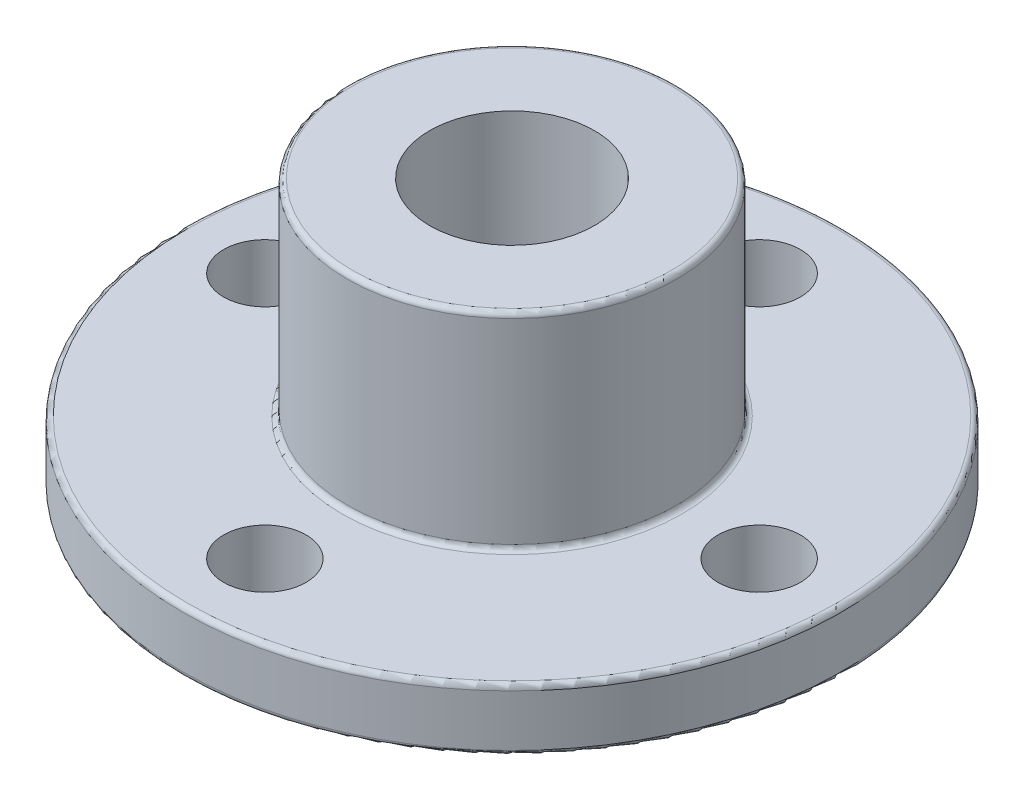
ISO-10303-21;
HEADER;
FILE_DESCRIPTION(('STEP AP214'),'2;1');
FILE_NAME('part.step','',(''),(''),'','','');
FILE_SCHEMA(('AUTOMOTIVE_DESIGN { 1 0 10303 214 1 1 1 1 }'));
ENDSEC;
DATA;
#1=APPLICATION_CONTEXT('core data for automotive mechanical design processes');
#2=APPLICATION_PROTOCOL_DEFINITION('international standard','automotive_design',2000,#1);
#3=PRODUCT_CONTEXT('',#1,'mechanical');
#4=PRODUCT('Part','Part','',(#3));
#5=PRODUCT_RELATED_PRODUCT_CATEGORY('part','',(#4));
#6=PRODUCT_DEFINITION_FORMATION('','',#4);
#7=PRODUCT_DEFINITION_CONTEXT('part definition',#1,'design');
#8=PRODUCT_DEFINITION('design','',#6,#7);
#9=PRODUCT_DEFINITION_SHAPE('','',#8);
#10=(LENGTH_UNIT() NAMED_UNIT(*) SI_UNIT(.MILLI.,.METRE.));
#11=(NAMED_UNIT(*) PLANE_ANGLE_UNIT() SI_UNIT($,.RADIAN.));
#12=(NAMED_UNIT(*) SI_UNIT($,.STERADIAN.) SOLID_ANGLE_UNIT());
#13=UNCERTAINTY_MEASURE_WITH_UNIT(LENGTH_MEASURE(1.E-05),#10,'distance_accuracy_value','');
#14=(GEOMETRIC_REPRESENTATION_CONTEXT(3) GLOBAL_UNCERTAINTY_ASSIGNED_CONTEXT((#13)) GLOBAL_UNIT_ASSIGNED_CONTEXT((#10,
#11,#12)) REPRESENTATION_CONTEXT('',''));
#15=CARTESIAN_POINT('',(0.,0.,0.));
#16=DIRECTION('',(0.,0.,1.));
#17=DIRECTION('',(1.,0.,0.));
#18=AXIS2_PLACEMENT_3D('',#15,#16,#17);
#19=CARTESIAN_POINT('',(0.,3.,0.));
#20=DIRECTION('',(0.,-1.,0.));
#21=DIRECTION('',(0.,0.,-1.));
#22=AXIS2_PLACEMENT_3D('',#19,#20,#21);
#23=CYLINDRICAL_SURFACE('',#22,16.);
#24=CARTESIAN_POINT('',(0.,0.25,0.));
#25=DIRECTION('',(0.,1.,0.));
#26=DIRECTION('',(0.,0.,1.));
#27=AXIS2_PLACEMENT_3D('',#24,#25,#26);
#28=CIRCLE('',#27,16.);
#29=CARTESIAN_POINT('',(0.,0.25,16.));
#30=VERTEX_POINT('',#29);
#31=EDGE_CURVE('E63',#30,#30,#28,.T.);
#32=ORIENTED_EDGE('',*,*,#31,.T.);
#33=EDGE_LOOP('',(#32));
#34=FACE_BOUND('',#33,.T.);
#35=CARTESIAN_POINT('',(0.,2.75,0.));
#36=DIRECTION('',(0.,1.,0.));
#37=DIRECTION('',(0.,0.,1.));
#38=AXIS2_PLACEMENT_3D('',#35,#36,#37);
#39=CIRCLE('',#38,16.);
#40=CARTESIAN_POINT('',(0.,2.75,16.));
#41=VERTEX_POINT('',#40);
#42=EDGE_CURVE('E66',#41,#41,#39,.F.);
#43=ORIENTED_EDGE('',*,*,#42,.T.);
#44=EDGE_LOOP('',(#43));
#45=FACE_BOUND('',#44,.T.);
#46=ADVANCED_FACE('F37',(#34,#45),#23,.T.);
#47=CARTESIAN_POINT('',(0.,3.,0.));
#48=DIRECTION('',(0.,1.,0.));
#49=DIRECTION('',(0.,0.,1.));
#50=AXIS2_PLACEMENT_3D('',#47,#48,#49);
#51=PLANE('',#50);
#52=CARTESIAN_POINT('',(0.,3.,-12.));
#53=DIRECTION('',(0.,1.,0.));
#54=DIRECTION('',(0.,0.,1.));
#55=AXIS2_PLACEMENT_3D('',#52,#53,#54);
#56=CIRCLE('',#55,2.);
#57=CARTESIAN_POINT('',(0.,3.,-10.));
#58=VERTEX_POINT('',#57);
#59=EDGE_CURVE('E92',#58,#58,#56,.T.);
#60=ORIENTED_EDGE('',*,*,#59,.F.);
#61=EDGE_LOOP('',(#60));
#62=FACE_BOUND('',#61,.T.);
#63=CARTESIAN_POINT('',(-12.,3.,0.));
#64=DIRECTION('',(0.,1.,0.));
#65=DIRECTION('',(0.,0.,1.));
#66=AXIS2_PLACEMENT_3D('',#63,#64,#65);
#67=CIRCLE('',#66,2.);
#68=CARTESIAN_POINT('',(-12.,3.,2.));
#69=VERTEX_POINT('',#68);
#70=EDGE_CURVE('E89',#69,#69,#67,.T.);
#71=ORIENTED_EDGE('',*,*,#70,.F.);
#72=EDGE_LOOP('',(#71));
#73=FACE_BOUND('',#72,.T.);
#74=CARTESIAN_POINT('',(0.,3.,12.));
#75=DIRECTION('',(0.,1.,0.));
#76=DIRECTION('',(0.,0.,1.));
#77=AXIS2_PLACEMENT_3D('',#74,#75,#76);
#78=CIRCLE('',#77,2.);
#79=CARTESIAN_POINT('',(0.,3.,14.));
#80=VERTEX_POINT('',#79);
#81=EDGE_CURVE('E83',#80,#80,#78,.T.);
#82=ORIENTED_EDGE('',*,*,#81,.F.);
#83=EDGE_LOOP('',(#82));
#84=FACE_BOUND('',#83,.T.);
#85=CARTESIAN_POINT('',(12.,3.,0.));
#86=DIRECTION('',(0.,1.,0.));
#87=DIRECTION('',(0.,0.,1.));
#88=AXIS2_PLACEMENT_3D('',#85,#86,#87);
#89=CIRCLE('',#88,2.);
#90=CARTESIAN_POINT('',(12.,3.,2.));
#91=VERTEX_POINT('',#90);
#92=EDGE_CURVE('E76',#91,#91,#89,.T.);
#93=ORIENTED_EDGE('',*,*,#92,.F.);
#94=EDGE_LOOP('',(#93));
#95=FACE_BOUND('',#94,.T.);
#96=CARTESIAN_POINT('',(0.,3.,0.));
#97=DIRECTION('',(0.,1.,0.));
#98=DIRECTION('',(0.,0.,1.));
#99=AXIS2_PLACEMENT_3D('',#96,#97,#98);
#100=CIRCLE('',#99,8.25);
#101=CARTESIAN_POINT('',(0.,3.,8.25));
#102=VERTEX_POINT('',#101);
#103=EDGE_CURVE('E44',#102,#102,#100,.F.);
#104=ORIENTED_EDGE('',*,*,#103,.T.);
#105=EDGE_LOOP('',(#104));
#106=FACE_BOUND('',#105,.T.);
#107=CARTESIAN_POINT('',(0.,3.,0.));
#108=DIRECTION('',(0.,1.,0.));
#109=DIRECTION('',(0.,0.,1.));
#110=AXIS2_PLACEMENT_3D('',#107,#108,#109);
#111=CIRCLE('',#110,15.75);
#112=CARTESIAN_POINT('',(0.,3.,15.75));
#113=VERTEX_POINT('',#112);
#114=EDGE_CURVE('E57',#113,#113,#111,.T.);
#115=ORIENTED_EDGE('',*,*,#114,.T.);
#116=EDGE_LOOP('',(#115));
#117=FACE_BOUND('',#116,.T.);
#118=ADVANCED_FACE('F103',(#62,#73,#84,#95,#106,#117),#51,.T.);
#119=CARTESIAN_POINT('',(0.,0.,0.));
#120=DIRECTION('',(0.,1.,0.));
#121=DIRECTION('',(0.,0.,1.));
#122=AXIS2_PLACEMENT_3D('',#119,#120,#121);
#123=PLANE('',#122);
#124=CARTESIAN_POINT('',(0.,0.,-12.));
#125=DIRECTION('',(0.,1.,0.));
#126=DIRECTION('',(0.,0.,1.));
#127=AXIS2_PLACEMENT_3D('',#124,#125,#126);
#128=CIRCLE('',#127,2.);
#129=CARTESIAN_POINT('',(0.,0.,-10.));
#130=VERTEX_POINT('',#129);
#131=EDGE_CURVE('E75',#130,#130,#128,.F.);
#132=ORIENTED_EDGE('',*,*,#131,.F.);
#133=EDGE_LOOP('',(#132));
#134=FACE_BOUND('',#133,.T.);
#135=CARTESIAN_POINT('',(-12.,0.,0.));
#136=DIRECTION('',(0.,1.,0.));
#137=DIRECTION('',(0.,0.,1.));
#138=AXIS2_PLACEMENT_3D('',#135,#136,#137);
#139=CIRCLE('',#138,2.);
#140=CARTESIAN_POINT('',(-12.,0.,2.));
#141=VERTEX_POINT('',#140);
#142=EDGE_CURVE('E86',#141,#141,#139,.F.);
#143=ORIENTED_EDGE('',*,*,#142,.F.);
#144=EDGE_LOOP('',(#143));
#145=FACE_BOUND('',#144,.T.);
#146=CARTESIAN_POINT('',(0.,0.,12.));
#147=DIRECTION('',(0.,1.,0.));
#148=DIRECTION('',(0.,0.,1.));
#149=AXIS2_PLACEMENT_3D('',#146,#147,#148);
#150=CIRCLE('',#149,2.);
#151=CARTESIAN_POINT('',(0.,0.,14.));
#152=VERTEX_POINT('',#151);
#153=EDGE_CURVE('E79',#152,#152,#150,.F.);
#154=ORIENTED_EDGE('',*,*,#153,.F.);
#155=EDGE_LOOP('',(#154));
#156=FACE_BOUND('',#155,.T.);
#157=CARTESIAN_POINT('',(12.,0.,0.));
#158=DIRECTION('',(0.,1.,0.));
#159=DIRECTION('',(0.,0.,1.));
#160=AXIS2_PLACEMENT_3D('',#157,#158,#159);
#161=CIRCLE('',#160,2.);
#162=CARTESIAN_POINT('',(12.,0.,2.));
#163=VERTEX_POINT('',#162);
#164=EDGE_CURVE('E80',#163,#163,#161,.F.);
#165=ORIENTED_EDGE('',*,*,#164,.F.);
#166=EDGE_LOOP('',(#165));
#167=FACE_BOUND('',#166,.T.);
#168=CARTESIAN_POINT('',(0.,0.,0.));
#169=DIRECTION('',(0.,1.,0.));
#170=DIRECTION('',(0.,0.,1.));
#171=AXIS2_PLACEMENT_3D('',#168,#169,#170);
#172=CIRCLE('',#171,4.);
#173=CARTESIAN_POINT('',(0.,0.,4.));
#174=VERTEX_POINT('',#173);
#175=EDGE_CURVE('E69',#174,#174,#172,.F.);
#176=ORIENTED_EDGE('',*,*,#175,.F.);
#177=EDGE_LOOP('',(#176));
#178=FACE_BOUND('',#177,.T.);
#179=CARTESIAN_POINT('',(0.,0.,0.));
#180=DIRECTION('',(0.,1.,0.));
#181=DIRECTION('',(0.,0.,1.));
#182=AXIS2_PLACEMENT_3D('',#179,#180,#181);
#183=CIRCLE('',#182,15.75);
#184=CARTESIAN_POINT('',(0.,0.,15.75));
#185=VERTEX_POINT('',#184);
#186=EDGE_CURVE('E60',#185,#185,#183,.F.);
#187=ORIENTED_EDGE('',*,*,#186,.T.);
#188=EDGE_LOOP('',(#187));
#189=FACE_BOUND('',#188,.T.);
#190=ADVANCED_FACE('F106',(#134,#145,#156,#167,#178,#189),#123,.F.);
#191=CARTESIAN_POINT('',(0.,0.25,0.));
#192=DIRECTION('',(0.,1.,0.));
#193=DIRECTION('',(0.,0.,1.));
#194=AXIS2_PLACEMENT_3D('',#191,#192,#193);
#195=TOROIDAL_SURFACE('',#194,15.75,0.25);
#196=ORIENTED_EDGE('',*,*,#186,.F.);
#197=EDGE_LOOP('',(#196));
#198=FACE_BOUND('',#197,.T.);
#199=ORIENTED_EDGE('',*,*,#31,.F.);
#200=EDGE_LOOP('',(#199));
#201=FACE_BOUND('',#200,.T.);
#202=ADVANCED_FACE('F119',(#198,#201),#195,.T.);
#203=CARTESIAN_POINT('',(0.,2.75,0.));
#204=DIRECTION('',(0.,1.,0.));
#205=DIRECTION('',(0.,0.,1.));
#206=AXIS2_PLACEMENT_3D('',#203,#204,#205);
#207=TOROIDAL_SURFACE('',#206,15.75,0.25);
#208=ORIENTED_EDGE('',*,*,#42,.F.);
#209=EDGE_LOOP('',(#208));
#210=FACE_BOUND('',#209,.T.);
#211=ORIENTED_EDGE('',*,*,#114,.F.);
#212=EDGE_LOOP('',(#211));
#213=FACE_BOUND('',#212,.T.);
#214=ADVANCED_FACE('F116',(#210,#213),#207,.T.);
#215=CARTESIAN_POINT('',(0.,13.,0.));
#216=DIRECTION('',(0.,-1.,0.));
#217=DIRECTION('',(0.,0.,-1.));
#218=AXIS2_PLACEMENT_3D('',#215,#216,#217);
#219=CYLINDRICAL_SURFACE('',#218,8.);
#220=CARTESIAN_POINT('',(0.,3.25,0.));
#221=DIRECTION('',(0.,1.,0.));
#222=DIRECTION('',(0.,0.,1.));
#223=AXIS2_PLACEMENT_3D('',#220,#221,#222);
#224=CIRCLE('',#223,8.);
#225=CARTESIAN_POINT('',(0.,3.25,8.));
#226=VERTEX_POINT('',#225);
#227=EDGE_CURVE('E48',#226,#226,#224,.T.);
#228=ORIENTED_EDGE('',*,*,#227,.T.);
#229=EDGE_LOOP('',(#228));
#230=FACE_BOUND('',#229,.T.);
#231=CARTESIAN_POINT('',(0.,12.75,0.));
#232=DIRECTION('',(0.,1.,0.));
#233=DIRECTION('',(0.,0.,1.));
#234=AXIS2_PLACEMENT_3D('',#231,#232,#233);
#235=CIRCLE('',#234,8.);
#236=CARTESIAN_POINT('',(0.,12.75,8.));
#237=VERTEX_POINT('',#236);
#238=EDGE_CURVE('E52',#237,#237,#235,.F.);
#239=ORIENTED_EDGE('',*,*,#238,.T.);
#240=EDGE_LOOP('',(#239));
#241=FACE_BOUND('',#240,.T.);
#242=ADVANCED_FACE('F118',(#230,#241),#219,.T.);
#243=CARTESIAN_POINT('',(0.,13.,0.));
#244=DIRECTION('',(0.,1.,0.));
#245=DIRECTION('',(0.,0.,1.));
#246=AXIS2_PLACEMENT_3D('',#243,#244,#245);
#247=PLANE('',#246);
#248=CARTESIAN_POINT('',(0.,13.,0.));
#249=DIRECTION('',(0.,1.,0.));
#250=DIRECTION('',(0.,0.,1.));
#251=AXIS2_PLACEMENT_3D('',#248,#249,#250);
#252=CIRCLE('',#251,4.);
#253=CARTESIAN_POINT('',(0.,13.,4.));
#254=VERTEX_POINT('',#253);
#255=EDGE_CURVE('E72',#254,#254,#252,.T.);
#256=ORIENTED_EDGE('',*,*,#255,.F.);
#257=EDGE_LOOP('',(#256));
#258=FACE_BOUND('',#257,.T.);
#259=CARTESIAN_POINT('',(0.,13.,0.));
#260=DIRECTION('',(0.,1.,0.));
#261=DIRECTION('',(0.,0.,1.));
#262=AXIS2_PLACEMENT_3D('',#259,#260,#261);
#263=CIRCLE('',#262,7.75);
#264=CARTESIAN_POINT('',(0.,13.,7.75));
#265=VERTEX_POINT('',#264);
#266=EDGE_CURVE('E10',#265,#265,#263,.T.);
#267=ORIENTED_EDGE('',*,*,#266,.T.);
#268=EDGE_LOOP('',(#267));
#269=FACE_BOUND('',#268,.T.);
#270=ADVANCED_FACE('F126',(#258,#269),#247,.T.);
#271=CARTESIAN_POINT('',(0.,3.25,0.));
#272=DIRECTION('',(0.,1.,0.));
#273=DIRECTION('',(0.,0.,1.));
#274=AXIS2_PLACEMENT_3D('',#271,#272,#273);
#275=TOROIDAL_SURFACE('',#274,8.25,0.25);
#276=ORIENTED_EDGE('',*,*,#103,.F.);
#277=EDGE_LOOP('',(#276));
#278=FACE_BOUND('',#277,.T.);
#279=ORIENTED_EDGE('',*,*,#227,.F.);
#280=EDGE_LOOP('',(#279));
#281=FACE_BOUND('',#280,.T.);
#282=ADVANCED_FACE('F144',(#278,#281),#275,.F.);
#283=CARTESIAN_POINT('',(0.,12.75,0.));
#284=DIRECTION('',(0.,1.,0.));
#285=DIRECTION('',(0.,0.,1.));
#286=AXIS2_PLACEMENT_3D('',#283,#284,#285);
#287=TOROIDAL_SURFACE('',#286,7.75,0.25);
#288=ORIENTED_EDGE('',*,*,#238,.F.);
#289=EDGE_LOOP('',(#288));
#290=FACE_BOUND('',#289,.T.);
#291=ORIENTED_EDGE('',*,*,#266,.F.);
#292=EDGE_LOOP('',(#291));
#293=FACE_BOUND('',#292,.T.);
#294=ADVANCED_FACE('F39',(#290,#293),#287,.T.);
#295=CARTESIAN_POINT('',(0.,-0.000999999999999265,0.));
#296=DIRECTION('',(0.,1.,0.));
#297=DIRECTION('',(0.,0.,1.));
#298=AXIS2_PLACEMENT_3D('',#295,#296,#297);
#299=CYLINDRICAL_SURFACE('',#298,4.);
#300=ORIENTED_EDGE('',*,*,#255,.T.);
#301=EDGE_LOOP('',(#300));
#302=FACE_BOUND('',#301,.T.);
#303=ORIENTED_EDGE('',*,*,#175,.T.);
#304=EDGE_LOOP('',(#303));
#305=FACE_BOUND('',#304,.T.);
#306=ADVANCED_FACE('F146',(#302,#305),#299,.F.);
#307=CARTESIAN_POINT('',(12.,-0.00100000000000013,0.));
#308=DIRECTION('',(0.,1.,0.));
#309=DIRECTION('',(0.,0.,1.));
#310=AXIS2_PLACEMENT_3D('',#307,#308,#309);
#311=CYLINDRICAL_SURFACE('',#310,2.);
#312=CARTESIAN_POINT('',(12.,3.,2.));
#313=CARTESIAN_POINT('',(12.,2.96875,2.));
#314=CARTESIAN_POINT('',(12.,2.9375,2.));
#315=CARTESIAN_POINT('',(12.,2.875,2.));
#316=CARTESIAN_POINT('',(12.,2.84375,2.));
#317=CARTESIAN_POINT('',(12.,2.78125,2.));
#318=CARTESIAN_POINT('',(12.,2.75,2.));
#319=CARTESIAN_POINT('',(12.,2.6875,2.));
#320=CARTESIAN_POINT('',(12.,2.65625,2.));
#321=CARTESIAN_POINT('',(12.,2.59375,2.));
#322=CARTESIAN_POINT('',(12.,2.5625,2.));
#323=CARTESIAN_POINT('',(12.,2.5,2.));
#324=CARTESIAN_POINT('',(12.,2.46875,2.));
#325=CARTESIAN_POINT('',(12.,2.40625,2.));
#326=CARTESIAN_POINT('',(12.,2.375,2.));
#327=CARTESIAN_POINT('',(12.,2.3125,2.));
#328=CARTESIAN_POINT('',(12.,2.28125,2.));
#329=CARTESIAN_POINT('',(12.,2.21875,2.));
#330=CARTESIAN_POINT('',(12.,2.1875,2.));
#331=CARTESIAN_POINT('',(12.,2.125,2.));
#332=CARTESIAN_POINT('',(12.,2.09375,2.));
#333=CARTESIAN_POINT('',(12.,2.03125,2.));
#334=CARTESIAN_POINT('',(12.,2.,2.));
#335=CARTESIAN_POINT('',(12.,1.9375,2.));
#336=CARTESIAN_POINT('',(12.,1.90625,2.));
#337=CARTESIAN_POINT('',(12.,1.84375,2.));
#338=CARTESIAN_POINT('',(12.,1.8125,2.));
#339=CARTESIAN_POINT('',(12.,1.75,2.));
#340=CARTESIAN_POINT('',(12.,1.71875,2.));
#341=CARTESIAN_POINT('',(12.,1.65625,2.));
#342=CARTESIAN_POINT('',(12.,1.625,2.));
#343=CARTESIAN_POINT('',(12.,1.5625,2.));
#344=CARTESIAN_POINT('',(12.,1.53125,2.));
#345=CARTESIAN_POINT('',(12.,1.46875,2.));
#346=CARTESIAN_POINT('',(12.,1.4375,2.));
#347=CARTESIAN_POINT('',(12.,1.375,2.));
#348=CARTESIAN_POINT('',(12.,1.34375,2.));
#349=CARTESIAN_POINT('',(12.,1.28125,2.));
#350=CARTESIAN_POINT('',(12.,1.25,2.));
#351=CARTESIAN_POINT('',(12.,1.1875,2.));
#352=CARTESIAN_POINT('',(12.,1.15625,2.));
#353=CARTESIAN_POINT('',(12.,1.09375,2.));
#354=CARTESIAN_POINT('',(12.,1.0625,2.));
#355=CARTESIAN_POINT('',(12.,1.,2.));
#356=CARTESIAN_POINT('',(12.,0.96875,2.));
#357=CARTESIAN_POINT('',(12.,0.90625,2.));
#358=CARTESIAN_POINT('',(12.,0.875,2.));
#359=CARTESIAN_POINT('',(12.,0.8125,2.));
#360=CARTESIAN_POINT('',(12.,0.78125,2.));
#361=CARTESIAN_POINT('',(12.,0.71875,2.));
#362=CARTESIAN_POINT('',(12.,0.6875,2.));
#363=CARTESIAN_POINT('',(12.,0.625,2.));
#364=CARTESIAN_POINT('',(12.,0.59375,2.));
#365=CARTESIAN_POINT('',(12.,0.53125,2.));
#366=CARTESIAN_POINT('',(12.,0.5,2.));
#367=CARTESIAN_POINT('',(12.,0.4375,2.));
#368=CARTESIAN_POINT('',(12.,0.40625,2.));
#369=CARTESIAN_POINT('',(12.,0.34375,2.));
#370=CARTESIAN_POINT('',(12.,0.3125,2.));
#371=CARTESIAN_POINT('',(12.,0.25,2.));
#372=CARTESIAN_POINT('',(12.,0.21875,2.));
#373=CARTESIAN_POINT('',(12.,0.15625,2.));
#374=CARTESIAN_POINT('',(12.,0.125,2.));
#375=CARTESIAN_POINT('',(12.,0.0625000000000001,2.));
#376=CARTESIAN_POINT('',(12.,0.0312500000000001,2.));
#377=CARTESIAN_POINT('',(12.,0.,2.));
#378=B_SPLINE_CURVE_WITH_KNOTS('',3,(#312,#313,#314,#315,#316,#317,#318,#319,#320,#321,#322,
#323,#324,#325,#326,#327,#328,#329,#330,#331,#332,#333,#334,#335,#336,#337,#338,#339,#340,#341,
#342,#343,#344,#345,#346,#347,#348,#349,#350,#351,#352,#353,#354,#355,#356,#357,#358,#359,#360,
#361,#362,#363,#364,#365,#366,#367,#368,#369,#370,#371,#372,#373,#374,#375,#376,#377),
.UNSPECIFIED.,.F.,.F.,(4,2,2,2,2,2,2,2,2,2,2,2,2,2,2,2,2,2,2,2,2,2,2,2,2,2,2,2,2,2,2,2,4),(0.,
0.0937500000000001,0.1875,0.28125,0.375,0.46875,0.5625,0.65625,0.75,0.84375,0.9375,1.03125,
1.125,1.21875,1.3125,1.40625,1.5,1.59375,1.6875,1.78125,1.875,1.96875,2.0625,2.15625,2.25,
2.34375,2.4375,2.53125,2.625,2.71875,2.8125,2.90625,3.),.UNSPECIFIED.);
#379=EDGE_CURVE('BSEAM149',#91,#163,#378,.T.);
#380=ORIENTED_EDGE('',*,*,#92,.T.);
#381=ORIENTED_EDGE('',*,*,#164,.T.);
#382=ORIENTED_EDGE('',*,*,#379,.T.);
#383=ORIENTED_EDGE('',*,*,#379,.F.);
#384=EDGE_LOOP('',(#380,#382,#381,#383));
#385=FACE_BOUND('',#384,.T.);
#386=ADVANCED_FACE('F149',(#385),#311,.F.);
#387=CARTESIAN_POINT('',(0.,-0.00100000000000013,12.));
#388=DIRECTION('',(0.,1.,0.));
#389=DIRECTION('',(0.,0.,1.));
#390=AXIS2_PLACEMENT_3D('',#387,#388,#389);
#391=CYLINDRICAL_SURFACE('',#390,2.);
#392=CARTESIAN_POINT('',(0.,3.,14.));
#393=CARTESIAN_POINT('',(0.,2.96875,14.));
#394=CARTESIAN_POINT('',(0.,2.9375,14.));
#395=CARTESIAN_POINT('',(0.,2.875,14.));
#396=CARTESIAN_POINT('',(0.,2.84375,14.));
#397=CARTESIAN_POINT('',(0.,2.78125,14.));
#398=CARTESIAN_POINT('',(0.,2.75,14.));
#399=CARTESIAN_POINT('',(0.,2.6875,14.));
#400=CARTESIAN_POINT('',(0.,2.65625,14.));
#401=CARTESIAN_POINT('',(0.,2.59375,14.));
#402=CARTESIAN_POINT('',(0.,2.5625,14.));
#403=CARTESIAN_POINT('',(0.,2.5,14.));
#404=CARTESIAN_POINT('',(0.,2.46875,14.));
#405=CARTESIAN_POINT('',(0.,2.40625,14.));
#406=CARTESIAN_POINT('',(0.,2.375,14.));
#407=CARTESIAN_POINT('',(0.,2.3125,14.));
#408=CARTESIAN_POINT('',(0.,2.28125,14.));
#409=CARTESIAN_POINT('',(0.,2.21875,14.));
#410=CARTESIAN_POINT('',(0.,2.1875,14.));
#411=CARTESIAN_POINT('',(0.,2.125,14.));
#412=CARTESIAN_POINT('',(0.,2.09375,14.));
#413=CARTESIAN_POINT('',(0.,2.03125,14.));
#414=CARTESIAN_POINT('',(0.,2.,14.));
#415=CARTESIAN_POINT('',(0.,1.9375,14.));
#416=CARTESIAN_POINT('',(0.,1.90625,14.));
#417=CARTESIAN_POINT('',(0.,1.84375,14.));
#418=CARTESIAN_POINT('',(0.,1.8125,14.));
#419=CARTESIAN_POINT('',(0.,1.75,14.));
#420=CARTESIAN_POINT('',(0.,1.71875,14.));
#421=CARTESIAN_POINT('',(0.,1.65625,14.));
#422=CARTESIAN_POINT('',(0.,1.625,14.));
#423=CARTESIAN_POINT('',(0.,1.5625,14.));
#424=CARTESIAN_POINT('',(0.,1.53125,14.));
#425=CARTESIAN_POINT('',(0.,1.46875,14.));
#426=CARTESIAN_POINT('',(0.,1.4375,14.));
#427=CARTESIAN_POINT('',(0.,1.375,14.));
#428=CARTESIAN_POINT('',(0.,1.34375,14.));
#429=CARTESIAN_POINT('',(0.,1.28125,14.));
#430=CARTESIAN_POINT('',(0.,1.25,14.));
#431=CARTESIAN_POINT('',(0.,1.1875,14.));
#432=CARTESIAN_POINT('',(0.,1.15625,14.));
#433=CARTESIAN_POINT('',(0.,1.09375,14.));
#434=CARTESIAN_POINT('',(0.,1.0625,14.));
#435=CARTESIAN_POINT('',(0.,1.,14.));
#436=CARTESIAN_POINT('',(0.,0.96875,14.));
#437=CARTESIAN_POINT('',(0.,0.90625,14.));
#438=CARTESIAN_POINT('',(0.,0.875,14.));
#439=CARTESIAN_POINT('',(0.,0.8125,14.));
#440=CARTESIAN_POINT('',(0.,0.78125,14.));
#441=CARTESIAN_POINT('',(0.,0.71875,14.));
#442=CARTESIAN_POINT('',(0.,0.6875,14.));
#443=CARTESIAN_POINT('',(0.,0.625,14.));
#444=CARTESIAN_POINT('',(0.,0.59375,14.));
#445=CARTESIAN_POINT('',(0.,0.53125,14.));
#446=CARTESIAN_POINT('',(0.,0.5,14.));
#447=CARTESIAN_POINT('',(0.,0.4375,14.));
#448=CARTESIAN_POINT('',(0.,0.40625,14.));
#449=CARTESIAN_POINT('',(0.,0.34375,14.));
#450=CARTESIAN_POINT('',(0.,0.3125,14.));
#451=CARTESIAN_POINT('',(0.,0.25,14.));
#452=CARTESIAN_POINT('',(0.,0.21875,14.));
#453=CARTESIAN_POINT('',(0.,0.15625,14.));
#454=CARTESIAN_POINT('',(0.,0.125,14.));
#455=CARTESIAN_POINT('',(0.,0.0625000000000001,14.));
#456=CARTESIAN_POINT('',(0.,0.0312500000000001,14.));
#457=CARTESIAN_POINT('',(0.,0.,14.));
#458=B_SPLINE_CURVE_WITH_KNOTS('',3,(#392,#393,#394,#395,#396,#397,#398,#399,#400,#401,#402,
#403,#404,#405,#406,#407,#408,#409,#410,#411,#412,#413,#414,#415,#416,#417,#418,#419,#420,#421,
#422,#423,#424,#425,#426,#427,#428,#429,#430,#431,#432,#433,#434,#435,#436,#437,#438,#439,#440,
#441,#442,#443,#444,#445,#446,#447,#448,#449,#450,#451,#452,#453,#454,#455,#456,#457),
.UNSPECIFIED.,.F.,.F.,(4,2,2,2,2,2,2,2,2,2,2,2,2,2,2,2,2,2,2,2,2,2,2,2,2,2,2,2,2,2,2,2,4),(0.,
0.0937500000000001,0.1875,0.28125,0.375,0.46875,0.5625,0.65625,0.75,0.84375,0.9375,1.03125,
1.125,1.21875,1.3125,1.40625,1.5,1.59375,1.6875,1.78125,1.875,1.96875,2.0625,2.15625,2.25,
2.34375,2.4375,2.53125,2.625,2.71875,2.8125,2.90625,3.),.UNSPECIFIED.);
#459=EDGE_CURVE('BSEAM153',#80,#152,#458,.T.);
#460=ORIENTED_EDGE('',*,*,#81,.T.);
#461=ORIENTED_EDGE('',*,*,#153,.T.);
#462=ORIENTED_EDGE('',*,*,#459,.T.);
#463=ORIENTED_EDGE('',*,*,#459,.F.);
#464=EDGE_LOOP('',(#460,#462,#461,#463));
#465=FACE_BOUND('',#464,.T.);
#466=ADVANCED_FACE('F153',(#465),#391,.F.);
#467=CARTESIAN_POINT('',(-12.,-0.00100000000000013,0.));
#468=DIRECTION('',(0.,1.,0.));
#469=DIRECTION('',(0.,0.,1.));
#470=AXIS2_PLACEMENT_3D('',#467,#468,#469);
#471=CYLINDRICAL_SURFACE('',#470,2.);
#472=CARTESIAN_POINT('',(-12.,3.,2.));
#473=CARTESIAN_POINT('',(-12.,2.96875,2.));
#474=CARTESIAN_POINT('',(-12.,2.9375,2.));
#475=CARTESIAN_POINT('',(-12.,2.875,2.));
#476=CARTESIAN_POINT('',(-12.,2.84375,2.));
#477=CARTESIAN_POINT('',(-12.,2.78125,2.));
#478=CARTESIAN_POINT('',(-12.,2.75,2.));
#479=CARTESIAN_POINT('',(-12.,2.6875,2.));
#480=CARTESIAN_POINT('',(-12.,2.65625,2.));
#481=CARTESIAN_POINT('',(-12.,2.59375,2.));
#482=CARTESIAN_POINT('',(-12.,2.5625,2.));
#483=CARTESIAN_POINT('',(-12.,2.5,2.));
#484=CARTESIAN_POINT('',(-12.,2.46875,2.));
#485=CARTESIAN_POINT('',(-12.,2.40625,2.));
#486=CARTESIAN_POINT('',(-12.,2.375,2.));
#487=CARTESIAN_POINT('',(-12.,2.3125,2.));
#488=CARTESIAN_POINT('',(-12.,2.28125,2.));
#489=CARTESIAN_POINT('',(-12.,2.21875,2.));
#490=CARTESIAN_POINT('',(-12.,2.1875,2.));
#491=CARTESIAN_POINT('',(-12.,2.125,2.));
#492=CARTESIAN_POINT('',(-12.,2.09375,2.));
#493=CARTESIAN_POINT('',(-12.,2.03125,2.));
#494=CARTESIAN_POINT('',(-12.,2.,2.));
#495=CARTESIAN_POINT('',(-12.,1.9375,2.));
#496=CARTESIAN_POINT('',(-12.,1.90625,2.));
#497=CARTESIAN_POINT('',(-12.,1.84375,2.));
#498=CARTESIAN_POINT('',(-12.,1.8125,2.));
#499=CARTESIAN_POINT('',(-12.,1.75,2.));
#500=CARTESIAN_POINT('',(-12.,1.71875,2.));
#501=CARTESIAN_POINT('',(-12.,1.65625,2.));
#502=CARTESIAN_POINT('',(-12.,1.625,2.));
#503=CARTESIAN_POINT('',(-12.,1.5625,2.));
#504=CARTESIAN_POINT('',(-12.,1.53125,2.));
#505=CARTESIAN_POINT('',(-12.,1.46875,2.));
#506=CARTESIAN_POINT('',(-12.,1.4375,2.));
#507=CARTESIAN_POINT('',(-12.,1.375,2.));
#508=CARTESIAN_POINT('',(-12.,1.34375,2.));
#509=CARTESIAN_POINT('',(-12.,1.28125,2.));
#510=CARTESIAN_POINT('',(-12.,1.25,2.));
#511=CARTESIAN_POINT('',(-12.,1.1875,2.));
#512=CARTESIAN_POINT('',(-12.,1.15625,2.));
#513=CARTESIAN_POINT('',(-12.,1.09375,2.));
#514=CARTESIAN_POINT('',(-12.,1.0625,2.));
#515=CARTESIAN_POINT('',(-12.,1.,2.));
#516=CARTESIAN_POINT('',(-12.,0.96875,2.));
#517=CARTESIAN_POINT('',(-12.,0.90625,2.));
#518=CARTESIAN_POINT('',(-12.,0.875,2.));
#519=CARTESIAN_POINT('',(-12.,0.8125,2.));
#520=CARTESIAN_POINT('',(-12.,0.78125,2.));
#521=CARTESIAN_POINT('',(-12.,0.71875,2.));
#522=CARTESIAN_POINT('',(-12.,0.6875,2.));
#523=CARTESIAN_POINT('',(-12.,0.625,2.));
#524=CARTESIAN_POINT('',(-12.,0.59375,2.));
#525=CARTESIAN_POINT('',(-12.,0.53125,2.));
#526=CARTESIAN_POINT('',(-12.,0.5,2.));
#527=CARTESIAN_POINT('',(-12.,0.4375,2.));
#528=CARTESIAN_POINT('',(-12.,0.40625,2.));
#529=CARTESIAN_POINT('',(-12.,0.34375,2.));
#530=CARTESIAN_POINT('',(-12.,0.3125,2.));
#531=CARTESIAN_POINT('',(-12.,0.25,2.));
#532=CARTESIAN_POINT('',(-12.,0.21875,2.));
#533=CARTESIAN_POINT('',(-12.,0.15625,2.));
#534=CARTESIAN_POINT('',(-12.,0.125,2.));
#535=CARTESIAN_POINT('',(-12.,0.0625000000000001,2.));
#536=CARTESIAN_POINT('',(-12.,0.0312500000000001,2.));
#537=CARTESIAN_POINT('',(-12.,0.,2.));
#538=B_SPLINE_CURVE_WITH_KNOTS('',3,(#472,#473,#474,#475,#476,#477,#478,#479,#480,#481,#482,
#483,#484,#485,#486,#487,#488,#489,#490,#491,#492,#493,#494,#495,#496,#497,#498,#499,#500,#501,
#502,#503,#504,#505,#506,#507,#508,#509,#510,#511,#512,#513,#514,#515,#516,#517,#518,#519,#520,
#521,#522,#523,#524,#525,#526,#527,#528,#529,#530,#531,#532,#533,#534,#535,#536,#537),
.UNSPECIFIED.,.F.,.F.,(4,2,2,2,2,2,2,2,2,2,2,2,2,2,2,2,2,2,2,2,2,2,2,2,2,2,2,2,2,2,2,2,4),(0.,
0.0937500000000001,0.1875,0.28125,0.375,0.46875,0.5625,0.65625,0.75,0.84375,0.9375,1.03125,
1.125,1.21875,1.3125,1.40625,1.5,1.59375,1.6875,1.78125,1.875,1.96875,2.0625,2.15625,2.25,
2.34375,2.4375,2.53125,2.625,2.71875,2.8125,2.90625,3.),.UNSPECIFIED.);
#539=EDGE_CURVE('BSEAM157',#69,#141,#538,.T.);
#540=ORIENTED_EDGE('',*,*,#70,.T.);
#541=ORIENTED_EDGE('',*,*,#142,.T.);
#542=ORIENTED_EDGE('',*,*,#539,.T.);
#543=ORIENTED_EDGE('',*,*,#539,.F.);
#544=EDGE_LOOP('',(#540,#542,#541,#543));
#545=FACE_BOUND('',#544,.T.);
#546=ADVANCED_FACE('F157',(#545),#471,.F.);
#547=CARTESIAN_POINT('',(0.,-0.00100000000000013,-12.));
#548=DIRECTION('',(0.,1.,0.));
#549=DIRECTION('',(0.,0.,1.));
#550=AXIS2_PLACEMENT_3D('',#547,#548,#549);
#551=CYLINDRICAL_SURFACE('',#550,2.);
#552=CARTESIAN_POINT('',(0.,3.,-10.));
#553=CARTESIAN_POINT('',(0.,2.96875,-10.));
#554=CARTESIAN_POINT('',(0.,2.9375,-10.));
#555=CARTESIAN_POINT('',(0.,2.875,-10.));
#556=CARTESIAN_POINT('',(0.,2.84375,-10.));
#557=CARTESIAN_POINT('',(0.,2.78125,-10.));
#558=CARTESIAN_POINT('',(0.,2.75,-10.));
#559=CARTESIAN_POINT('',(0.,2.6875,-10.));
#560=CARTESIAN_POINT('',(0.,2.65625,-10.));
#561=CARTESIAN_POINT('',(0.,2.59375,-10.));
#562=CARTESIAN_POINT('',(0.,2.5625,-10.));
#563=CARTESIAN_POINT('',(0.,2.5,-10.));
#564=CARTESIAN_POINT('',(0.,2.46875,-10.));
#565=CARTESIAN_POINT('',(0.,2.40625,-10.));
#566=CARTESIAN_POINT('',(0.,2.375,-10.));
#567=CARTESIAN_POINT('',(0.,2.3125,-10.));
#568=CARTESIAN_POINT('',(0.,2.28125,-10.));
#569=CARTESIAN_POINT('',(0.,2.21875,-10.));
#570=CARTESIAN_POINT('',(0.,2.1875,-10.));
#571=CARTESIAN_POINT('',(0.,2.125,-10.));
#572=CARTESIAN_POINT('',(0.,2.09375,-10.));
#573=CARTESIAN_POINT('',(0.,2.03125,-10.));
#574=CARTESIAN_POINT('',(0.,2.,-10.));
#575=CARTESIAN_POINT('',(0.,1.9375,-10.));
#576=CARTESIAN_POINT('',(0.,1.90625,-10.));
#577=CARTESIAN_POINT('',(0.,1.84375,-10.));
#578=CARTESIAN_POINT('',(0.,1.8125,-10.));
#579=CARTESIAN_POINT('',(0.,1.75,-10.));
#580=CARTESIAN_POINT('',(0.,1.71875,-10.));
#581=CARTESIAN_POINT('',(0.,1.65625,-10.));
#582=CARTESIAN_POINT('',(0.,1.625,-10.));
#583=CARTESIAN_POINT('',(0.,1.5625,-10.));
#584=CARTESIAN_POINT('',(0.,1.53125,-10.));
#585=CARTESIAN_POINT('',(0.,1.46875,-10.));
#586=CARTESIAN_POINT('',(0.,1.4375,-10.));
#587=CARTESIAN_POINT('',(0.,1.375,-10.));
#588=CARTESIAN_POINT('',(0.,1.34375,-10.));
#589=CARTESIAN_POINT('',(0.,1.28125,-10.));
#590=CARTESIAN_POINT('',(0.,1.25,-10.));
#591=CARTESIAN_POINT('',(0.,1.1875,-10.));
#592=CARTESIAN_POINT('',(0.,1.15625,-10.));
#593=CARTESIAN_POINT('',(0.,1.09375,-10.));
#594=CARTESIAN_POINT('',(0.,1.0625,-10.));
#595=CARTESIAN_POINT('',(0.,1.,-10.));
#596=CARTESIAN_POINT('',(0.,0.96875,-10.));
#597=CARTESIAN_POINT('',(0.,0.90625,-10.));
#598=CARTESIAN_POINT('',(0.,0.875,-10.));
#599=CARTESIAN_POINT('',(0.,0.8125,-10.));
#600=CARTESIAN_POINT('',(0.,0.78125,-10.));
#601=CARTESIAN_POINT('',(0.,0.71875,-10.));
#602=CARTESIAN_POINT('',(0.,0.6875,-10.));
#603=CARTESIAN_POINT('',(0.,0.625,-10.));
#604=CARTESIAN_POINT('',(0.,0.59375,-10.));
#605=CARTESIAN_POINT('',(0.,0.53125,-10.));
#606=CARTESIAN_POINT('',(0.,0.5,-10.));
#607=CARTESIAN_POINT('',(0.,0.4375,-10.));
#608=CARTESIAN_POINT('',(0.,0.40625,-10.));
#609=CARTESIAN_POINT('',(0.,0.34375,-10.));
#610=CARTESIAN_POINT('',(0.,0.3125,-10.));
#611=CARTESIAN_POINT('',(0.,0.25,-10.));
#612=CARTESIAN_POINT('',(0.,0.21875,-10.));
#613=CARTESIAN_POINT('',(0.,0.15625,-10.));
#614=CARTESIAN_POINT('',(0.,0.125,-10.));
#615=CARTESIAN_POINT('',(0.,0.0625000000000001,-10.));
#616=CARTESIAN_POINT('',(0.,0.0312500000000001,-10.));
#617=CARTESIAN_POINT('',(0.,0.,-10.));
#618=B_SPLINE_CURVE_WITH_KNOTS('',3,(#552,#553,#554,#555,#556,#557,#558,#559,#560,#561,#562,
#563,#564,#565,#566,#567,#568,#569,#570,#571,#572,#573,#574,#575,#576,#577,#578,#579,#580,#581,
#582,#583,#584,#585,#586,#587,#588,#589,#590,#591,#592,#593,#594,#595,#596,#597,#598,#599,#600,
#601,#602,#603,#604,#605,#606,#607,#608,#609,#610,#611,#612,#613,#614,#615,#616,#617),
.UNSPECIFIED.,.F.,.F.,(4,2,2,2,2,2,2,2,2,2,2,2,2,2,2,2,2,2,2,2,2,2,2,2,2,2,2,2,2,2,2,2,4),(0.,
0.0937500000000001,0.1875,0.28125,0.375,0.46875,0.5625,0.65625,0.75,0.84375,0.9375,1.03125,
1.125,1.21875,1.3125,1.40625,1.5,1.59375,1.6875,1.78125,1.875,1.96875,2.0625,2.15625,2.25,
2.34375,2.4375,2.53125,2.625,2.71875,2.8125,2.90625,3.),.UNSPECIFIED.);
#619=EDGE_CURVE('BSEAM100',#58,#130,#618,.T.);
#620=ORIENTED_EDGE('',*,*,#59,.T.);
#621=ORIENTED_EDGE('',*,*,#131,.T.);
#622=ORIENTED_EDGE('',*,*,#619,.T.);
#623=ORIENTED_EDGE('',*,*,#619,.F.);
#624=EDGE_LOOP('',(#620,#622,#621,#623));
#625=FACE_BOUND('',#624,.T.);
#626=ADVANCED_FACE('F100',(#625),#551,.F.);
#627=CLOSED_SHELL('',(#46,#118,#190,#202,#214,#242,#270,#282,#294,#306,#386,#466,#546,#626));
#628=MANIFOLD_SOLID_BREP('B2',#627);
#629=ADVANCED_BREP_SHAPE_REPRESENTATION('',(#18,#628),#14);
#630=SHAPE_DEFINITION_REPRESENTATION(#9,#629);
ENDSEC;
END-ISO-10303-21;
